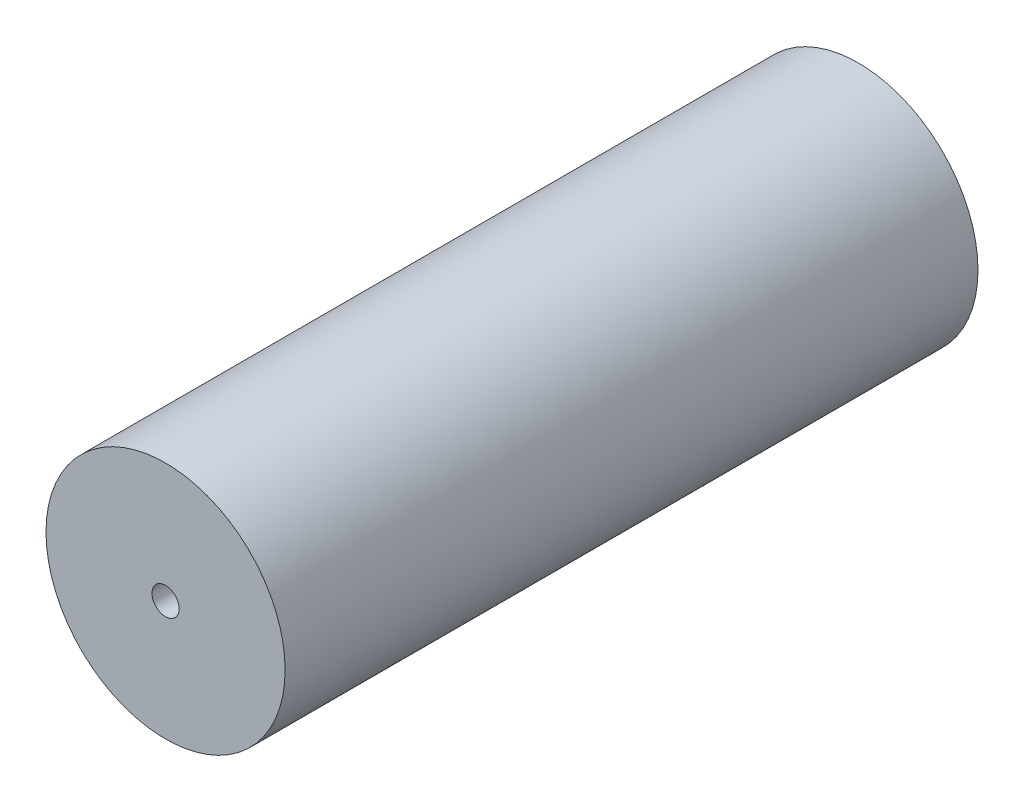
ISO-10303-21;
HEADER;
FILE_DESCRIPTION(('STEP AP214'),'2;1');
FILE_NAME('part.step','',(''),(''),'','','');
FILE_SCHEMA(('AUTOMOTIVE_DESIGN { 1 0 10303 214 1 1 1 1 }'));
ENDSEC;
DATA;
#1=APPLICATION_CONTEXT('core data for automotive mechanical design processes');
#2=APPLICATION_PROTOCOL_DEFINITION('international standard','automotive_design',2000,#1);
#3=PRODUCT_CONTEXT('',#1,'mechanical');
#4=PRODUCT('Part','Part','',(#3));
#5=PRODUCT_RELATED_PRODUCT_CATEGORY('part','',(#4));
#6=PRODUCT_DEFINITION_FORMATION('','',#4);
#7=PRODUCT_DEFINITION_CONTEXT('part definition',#1,'design');
#8=PRODUCT_DEFINITION('design','',#6,#7);
#9=PRODUCT_DEFINITION_SHAPE('','',#8);
#10=(LENGTH_UNIT() NAMED_UNIT(*) SI_UNIT(.MILLI.,.METRE.));
#11=(NAMED_UNIT(*) PLANE_ANGLE_UNIT() SI_UNIT($,.RADIAN.));
#12=(NAMED_UNIT(*) SI_UNIT($,.STERADIAN.) SOLID_ANGLE_UNIT());
#13=UNCERTAINTY_MEASURE_WITH_UNIT(LENGTH_MEASURE(1.E-05),#10,'distance_accuracy_value','');
#14=(GEOMETRIC_REPRESENTATION_CONTEXT(3) GLOBAL_UNCERTAINTY_ASSIGNED_CONTEXT((#13)) GLOBAL_UNIT_ASSIGNED_CONTEXT((#10,
#11,#12)) REPRESENTATION_CONTEXT('',''));
#15=CARTESIAN_POINT('',(0.,0.,0.));
#16=DIRECTION('',(0.,0.,1.));
#17=DIRECTION('',(1.,0.,0.));
#18=AXIS2_PLACEMENT_3D('',#15,#16,#17);
#19=CARTESIAN_POINT('',(0.,0.,135.));
#20=DIRECTION('',(0.,0.,-1.));
#21=DIRECTION('',(-1.,0.,0.));
#22=AXIS2_PLACEMENT_3D('',#19,#20,#21);
#23=CYLINDRICAL_SURFACE('',#22,2.5);
#24=CARTESIAN_POINT('',(0.,0.,127.5));
#25=DIRECTION('',(0.,0.,1.));
#26=DIRECTION('',(1.,0.,0.));
#27=AXIS2_PLACEMENT_3D('',#24,#25,#26);
#28=CIRCLE('',#27,2.5);
#29=CARTESIAN_POINT('',(2.5,0.,127.5));
#30=VERTEX_POINT('',#29);
#31=EDGE_CURVE('E46',#30,#30,#28,.T.);
#32=ORIENTED_EDGE('',*,*,#31,.T.);
#33=EDGE_LOOP('',(#32));
#34=FACE_BOUND('',#33,.T.);
#35=CARTESIAN_POINT('',(0.,0.,30.));
#36=DIRECTION('',(0.,0.,-1.));
#37=DIRECTION('',(-1.,0.,0.));
#38=AXIS2_PLACEMENT_3D('',#35,#36,#37);
#39=CIRCLE('',#38,2.5);
#40=CARTESIAN_POINT('',(-2.5,0.,30.));
#41=VERTEX_POINT('',#40);
#42=EDGE_CURVE('E37',#41,#41,#39,.F.);
#43=ORIENTED_EDGE('',*,*,#42,.F.);
#44=EDGE_LOOP('',(#43));
#45=FACE_BOUND('',#44,.T.);
#46=ADVANCED_FACE('F33',(#34,#45),#23,.F.);
#47=CARTESIAN_POINT('',(0.,0.,127.5));
#48=DIRECTION('',(0.,0.,-1.));
#49=DIRECTION('',(-1.,0.,0.));
#50=AXIS2_PLACEMENT_3D('',#47,#48,#49);
#51=CYLINDRICAL_SURFACE('',#50,22.);
#52=CARTESIAN_POINT('',(0.,0.,127.5));
#53=DIRECTION('',(0.,0.,1.));
#54=DIRECTION('',(1.,0.,0.));
#55=AXIS2_PLACEMENT_3D('',#52,#53,#54);
#56=CIRCLE('',#55,22.);
#57=CARTESIAN_POINT('',(22.,0.,127.5));
#58=VERTEX_POINT('',#57);
#59=EDGE_CURVE('E10',#58,#58,#56,.T.);
#60=ORIENTED_EDGE('',*,*,#59,.F.);
#61=EDGE_LOOP('',(#60));
#62=FACE_BOUND('',#61,.T.);
#63=CARTESIAN_POINT('',(0.,0.,0.));
#64=DIRECTION('',(0.,0.,1.));
#65=DIRECTION('',(1.,0.,0.));
#66=AXIS2_PLACEMENT_3D('',#63,#64,#65);
#67=CIRCLE('',#66,22.);
#68=CARTESIAN_POINT('',(22.,0.,0.));
#69=VERTEX_POINT('',#68);
#70=EDGE_CURVE('E41',#69,#69,#67,.T.);
#71=ORIENTED_EDGE('',*,*,#70,.T.);
#72=EDGE_LOOP('',(#71));
#73=FACE_BOUND('',#72,.T.);
#74=ADVANCED_FACE('F35',(#62,#73),#51,.T.);
#75=CARTESIAN_POINT('',(0.,0.,127.5));
#76=DIRECTION('',(0.,0.,1.));
#77=DIRECTION('',(1.,0.,0.));
#78=AXIS2_PLACEMENT_3D('',#75,#76,#77);
#79=PLANE('',#78);
#80=ORIENTED_EDGE('',*,*,#31,.F.);
#81=EDGE_LOOP('',(#80));
#82=FACE_BOUND('',#81,.T.);
#83=ORIENTED_EDGE('',*,*,#59,.T.);
#84=EDGE_LOOP('',(#83));
#85=FACE_BOUND('',#84,.T.);
#86=ADVANCED_FACE('F68',(#82,#85),#79,.T.);
#87=CARTESIAN_POINT('',(0.,0.,0.));
#88=DIRECTION('',(0.,0.,1.));
#89=DIRECTION('',(1.,0.,0.));
#90=AXIS2_PLACEMENT_3D('',#87,#88,#89);
#91=PLANE('',#90);
#92=CARTESIAN_POINT('',(0.,0.,0.));
#93=DIRECTION('',(0.,0.,-1.));
#94=DIRECTION('',(-1.,0.,0.));
#95=AXIS2_PLACEMENT_3D('',#92,#93,#94);
#96=CIRCLE('',#95,17.5);
#97=CARTESIAN_POINT('',(-17.5,0.,0.));
#98=VERTEX_POINT('',#97);
#99=EDGE_CURVE('E50',#98,#98,#96,.T.);
#100=ORIENTED_EDGE('',*,*,#99,.F.);
#101=EDGE_LOOP('',(#100));
#102=FACE_BOUND('',#101,.T.);
#103=ORIENTED_EDGE('',*,*,#70,.F.);
#104=EDGE_LOOP('',(#103));
#105=FACE_BOUND('',#104,.T.);
#106=ADVANCED_FACE('F75',(#102,#105),#91,.F.);
#107=CARTESIAN_POINT('',(0.,0.,30.));
#108=DIRECTION('',(0.,0.,-1.));
#109=DIRECTION('',(-1.,0.,0.));
#110=AXIS2_PLACEMENT_3D('',#107,#108,#109);
#111=PLANE('',#110);
#112=CARTESIAN_POINT('',(0.,0.,30.));
#113=DIRECTION('',(0.,0.,-1.));
#114=DIRECTION('',(-1.,0.,0.));
#115=AXIS2_PLACEMENT_3D('',#112,#113,#114);
#116=CIRCLE('',#115,17.5);
#117=CARTESIAN_POINT('',(-17.5,0.,30.));
#118=VERTEX_POINT('',#117);
#119=EDGE_CURVE('E53',#118,#118,#116,.T.);
#120=ORIENTED_EDGE('',*,*,#119,.T.);
#121=EDGE_LOOP('',(#120));
#122=FACE_BOUND('',#121,.T.);
#123=ORIENTED_EDGE('',*,*,#42,.T.);
#124=EDGE_LOOP('',(#123));
#125=FACE_BOUND('',#124,.T.);
#126=ADVANCED_FACE('F60',(#122,#125),#111,.T.);
#127=CARTESIAN_POINT('',(0.,0.,30.));
#128=DIRECTION('',(0.,0.,-1.));
#129=DIRECTION('',(-1.,0.,0.));
#130=AXIS2_PLACEMENT_3D('',#127,#128,#129);
#131=CYLINDRICAL_SURFACE('',#130,17.5);
#132=ORIENTED_EDGE('',*,*,#119,.F.);
#133=EDGE_LOOP('',(#132));
#134=FACE_BOUND('',#133,.T.);
#135=ORIENTED_EDGE('',*,*,#99,.T.);
#136=EDGE_LOOP('',(#135));
#137=FACE_BOUND('',#136,.T.);
#138=ADVANCED_FACE('F72',(#134,#137),#131,.F.);
#139=CLOSED_SHELL('',(#46,#74,#86,#106,#126,#138));
#140=MANIFOLD_SOLID_BREP('B2',#139);
#141=ADVANCED_BREP_SHAPE_REPRESENTATION('',(#18,#140),#14);
#142=SHAPE_DEFINITION_REPRESENTATION(#9,#141);
ENDSEC;
END-ISO-10303-21;
